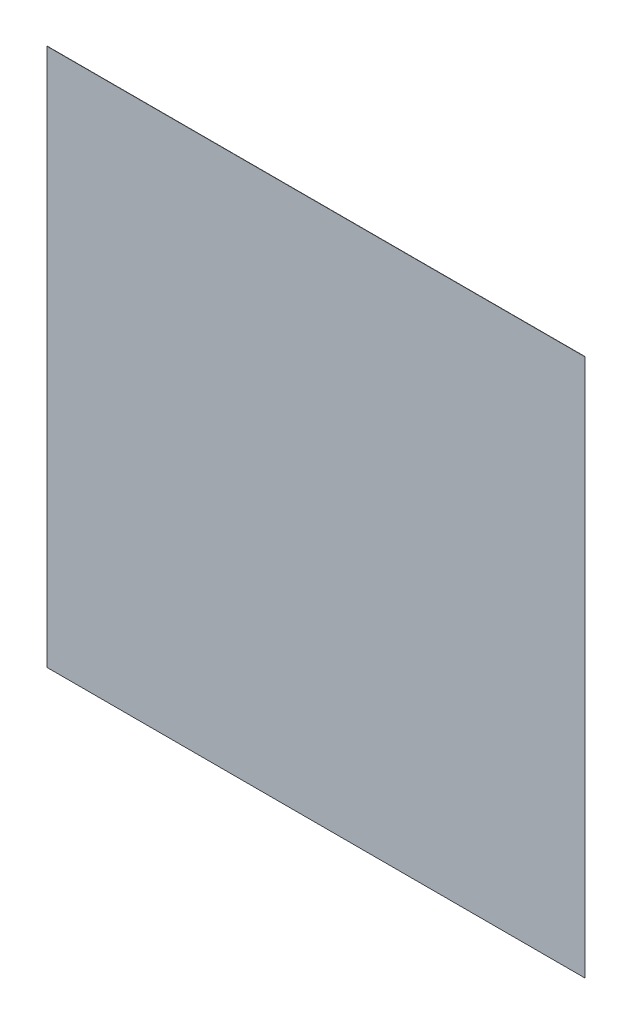
ISO-10303-21;
HEADER;
FILE_DESCRIPTION(('STEP AP214'),'2;1');
FILE_NAME('part.step','',(''),(''),'','','');
FILE_SCHEMA(('AUTOMOTIVE_DESIGN { 1 0 10303 214 1 1 1 1 }'));
ENDSEC;
DATA;
#1=APPLICATION_CONTEXT('core data for automotive mechanical design processes');
#2=APPLICATION_PROTOCOL_DEFINITION('international standard','automotive_design',2000,#1);
#3=PRODUCT_CONTEXT('',#1,'mechanical');
#4=PRODUCT('Part','Part','',(#3));
#5=PRODUCT_RELATED_PRODUCT_CATEGORY('part','',(#4));
#6=PRODUCT_DEFINITION_FORMATION('','',#4);
#7=PRODUCT_DEFINITION_CONTEXT('part definition',#1,'design');
#8=PRODUCT_DEFINITION('design','',#6,#7);
#9=PRODUCT_DEFINITION_SHAPE('','',#8);
#10=(LENGTH_UNIT() NAMED_UNIT(*) SI_UNIT(.MILLI.,.METRE.));
#11=(NAMED_UNIT(*) PLANE_ANGLE_UNIT() SI_UNIT($,.RADIAN.));
#12=(NAMED_UNIT(*) SI_UNIT($,.STERADIAN.) SOLID_ANGLE_UNIT());
#13=UNCERTAINTY_MEASURE_WITH_UNIT(LENGTH_MEASURE(1.E-05),#10,'distance_accuracy_value','');
#14=(GEOMETRIC_REPRESENTATION_CONTEXT(3) GLOBAL_UNCERTAINTY_ASSIGNED_CONTEXT((#13)) GLOBAL_UNIT_ASSIGNED_CONTEXT((#10,
#11,#12)) REPRESENTATION_CONTEXT('',''));
#15=CARTESIAN_POINT('',(0.,0.,0.));
#16=DIRECTION('',(0.,0.,1.));
#17=DIRECTION('',(1.,0.,0.));
#18=AXIS2_PLACEMENT_3D('',#15,#16,#17);
#19=CARTESIAN_POINT('',(110.,-110.,0.1));
#20=DIRECTION('',(-1.,0.,0.));
#21=DIRECTION('',(0.,-1.,0.));
#22=AXIS2_PLACEMENT_3D('',#19,#20,#21);
#23=PLANE('',#22);
#24=DIRECTION('',(0.,1.,0.));
#25=VECTOR('',#24,1.);
#26=CARTESIAN_POINT('',(110.,-110.,0.));
#27=LINE('',#26,#25);
#28=CARTESIAN_POINT('',(110.,-110.,0.));
#29=VERTEX_POINT('',#28);
#30=CARTESIAN_POINT('',(110.,110.,0.));
#31=VERTEX_POINT('',#30);
#32=EDGE_CURVE('E107',#29,#31,#27,.T.);
#33=ORIENTED_EDGE('',*,*,#32,.T.);
#34=DIRECTION('',(0.,0.,-1.));
#35=VECTOR('',#34,1.);
#36=CARTESIAN_POINT('',(110.,110.,0.1));
#37=LINE('',#36,#35);
#38=CARTESIAN_POINT('',(110.,110.,0.1));
#39=VERTEX_POINT('',#38);
#40=EDGE_CURVE('E11',#39,#31,#37,.T.);
#41=ORIENTED_EDGE('',*,*,#40,.F.);
#42=DIRECTION('',(0.,1.,0.));
#43=VECTOR('',#42,1.);
#44=CARTESIAN_POINT('',(110.,-110.,0.1));
#45=LINE('',#44,#43);
#46=CARTESIAN_POINT('',(110.,-110.,0.1));
#47=VERTEX_POINT('',#46);
#48=EDGE_CURVE('E91',#47,#39,#45,.T.);
#49=ORIENTED_EDGE('',*,*,#48,.F.);
#50=DIRECTION('',(0.,0.,-1.));
#51=VECTOR('',#50,1.);
#52=CARTESIAN_POINT('',(110.,-110.,0.1));
#53=LINE('',#52,#51);
#54=EDGE_CURVE('E103',#47,#29,#53,.T.);
#55=ORIENTED_EDGE('',*,*,#54,.T.);
#56=EDGE_LOOP('',(#33,#41,#49,#55));
#57=FACE_BOUND('',#56,.T.);
#58=ADVANCED_FACE('F39',(#57),#23,.F.);
#59=CARTESIAN_POINT('',(-110.,110.,0.1));
#60=DIRECTION('',(0.,-1.,0.));
#61=DIRECTION('',(0.,0.,-1.));
#62=AXIS2_PLACEMENT_3D('',#59,#60,#61);
#63=PLANE('',#62);
#64=DIRECTION('',(-1.,0.,0.));
#65=VECTOR('',#64,1.);
#66=CARTESIAN_POINT('',(-110.,110.,0.));
#67=LINE('',#66,#65);
#68=CARTESIAN_POINT('',(-110.,110.,0.));
#69=VERTEX_POINT('',#68);
#70=EDGE_CURVE('E96',#31,#69,#67,.T.);
#71=ORIENTED_EDGE('',*,*,#70,.T.);
#72=DIRECTION('',(0.,0.,-1.));
#73=VECTOR('',#72,1.);
#74=CARTESIAN_POINT('',(-110.,110.,0.1));
#75=LINE('',#74,#73);
#76=CARTESIAN_POINT('',(-110.,110.,0.1));
#77=VERTEX_POINT('',#76);
#78=EDGE_CURVE('E48',#77,#69,#75,.T.);
#79=ORIENTED_EDGE('',*,*,#78,.F.);
#80=DIRECTION('',(-1.,0.,0.));
#81=VECTOR('',#80,1.);
#82=CARTESIAN_POINT('',(-110.,110.,0.1));
#83=LINE('',#82,#81);
#84=EDGE_CURVE('E86',#39,#77,#83,.T.);
#85=ORIENTED_EDGE('',*,*,#84,.F.);
#86=ORIENTED_EDGE('',*,*,#40,.T.);
#87=EDGE_LOOP('',(#71,#79,#85,#86));
#88=FACE_BOUND('',#87,.T.);
#89=ADVANCED_FACE('F95',(#88),#63,.F.);
#90=CARTESIAN_POINT('',(-110.,-110.,0.1));
#91=DIRECTION('',(1.,0.,0.));
#92=DIRECTION('',(0.,1.,0.));
#93=AXIS2_PLACEMENT_3D('',#90,#91,#92);
#94=PLANE('',#93);
#95=DIRECTION('',(0.,-1.,0.));
#96=VECTOR('',#95,1.);
#97=CARTESIAN_POINT('',(-110.,-110.,0.));
#98=LINE('',#97,#96);
#99=CARTESIAN_POINT('',(-110.,-110.,0.));
#100=VERTEX_POINT('',#99);
#101=EDGE_CURVE('E73',#69,#100,#98,.T.);
#102=ORIENTED_EDGE('',*,*,#101,.T.);
#103=DIRECTION('',(0.,0.,-1.));
#104=VECTOR('',#103,1.);
#105=CARTESIAN_POINT('',(-110.,-110.,0.1));
#106=LINE('',#105,#104);
#107=CARTESIAN_POINT('',(-110.,-110.,0.1));
#108=VERTEX_POINT('',#107);
#109=EDGE_CURVE('E98',#108,#100,#106,.T.);
#110=ORIENTED_EDGE('',*,*,#109,.F.);
#111=DIRECTION('',(0.,-1.,0.));
#112=VECTOR('',#111,1.);
#113=CARTESIAN_POINT('',(-110.,-110.,0.1));
#114=LINE('',#113,#112);
#115=EDGE_CURVE('E89',#77,#108,#114,.T.);
#116=ORIENTED_EDGE('',*,*,#115,.F.);
#117=ORIENTED_EDGE('',*,*,#78,.T.);
#118=EDGE_LOOP('',(#102,#110,#116,#117));
#119=FACE_BOUND('',#118,.T.);
#120=ADVANCED_FACE('F99',(#119),#94,.F.);
#121=CARTESIAN_POINT('',(-110.,-110.,0.1));
#122=DIRECTION('',(0.,1.,0.));
#123=DIRECTION('',(0.,0.,1.));
#124=AXIS2_PLACEMENT_3D('',#121,#122,#123);
#125=PLANE('',#124);
#126=DIRECTION('',(1.,0.,0.));
#127=VECTOR('',#126,1.);
#128=CARTESIAN_POINT('',(-110.,-110.,0.));
#129=LINE('',#128,#127);
#130=EDGE_CURVE('E79',#100,#29,#129,.T.);
#131=ORIENTED_EDGE('',*,*,#130,.T.);
#132=ORIENTED_EDGE('',*,*,#54,.F.);
#133=DIRECTION('',(1.,0.,0.));
#134=VECTOR('',#133,1.);
#135=CARTESIAN_POINT('',(-110.,-110.,0.1));
#136=LINE('',#135,#134);
#137=EDGE_CURVE('E56',#108,#47,#136,.T.);
#138=ORIENTED_EDGE('',*,*,#137,.F.);
#139=ORIENTED_EDGE('',*,*,#109,.T.);
#140=EDGE_LOOP('',(#131,#132,#138,#139));
#141=FACE_BOUND('',#140,.T.);
#142=ADVANCED_FACE('F120',(#141),#125,.F.);
#143=CARTESIAN_POINT('',(0.,0.,0.1));
#144=DIRECTION('',(0.,0.,-1.));
#145=DIRECTION('',(-1.,0.,0.));
#146=AXIS2_PLACEMENT_3D('',#143,#144,#145);
#147=PLANE('',#146);
#148=ORIENTED_EDGE('',*,*,#48,.T.);
#149=ORIENTED_EDGE('',*,*,#84,.T.);
#150=ORIENTED_EDGE('',*,*,#115,.T.);
#151=ORIENTED_EDGE('',*,*,#137,.T.);
#152=EDGE_LOOP('',(#148,#149,#150,#151));
#153=FACE_BOUND('',#152,.T.);
#154=ADVANCED_FACE('F87',(#153),#147,.F.);
#155=CARTESIAN_POINT('',(0.,0.,0.));
#156=DIRECTION('',(0.,0.,-1.));
#157=DIRECTION('',(-1.,0.,0.));
#158=AXIS2_PLACEMENT_3D('',#155,#156,#157);
#159=PLANE('',#158);
#160=ORIENTED_EDGE('',*,*,#32,.F.);
#161=ORIENTED_EDGE('',*,*,#130,.F.);
#162=ORIENTED_EDGE('',*,*,#101,.F.);
#163=ORIENTED_EDGE('',*,*,#70,.F.);
#164=EDGE_LOOP('',(#160,#161,#162,#163));
#165=FACE_BOUND('',#164,.T.);
#166=ADVANCED_FACE('F123',(#165),#159,.T.);
#167=CLOSED_SHELL('',(#58,#89,#120,#142,#154,#166));
#168=MANIFOLD_SOLID_BREP('B2',#167);
#169=ADVANCED_BREP_SHAPE_REPRESENTATION('',(#18,#168),#14);
#170=SHAPE_DEFINITION_REPRESENTATION(#9,#169);
ENDSEC;
END-ISO-10303-21;
